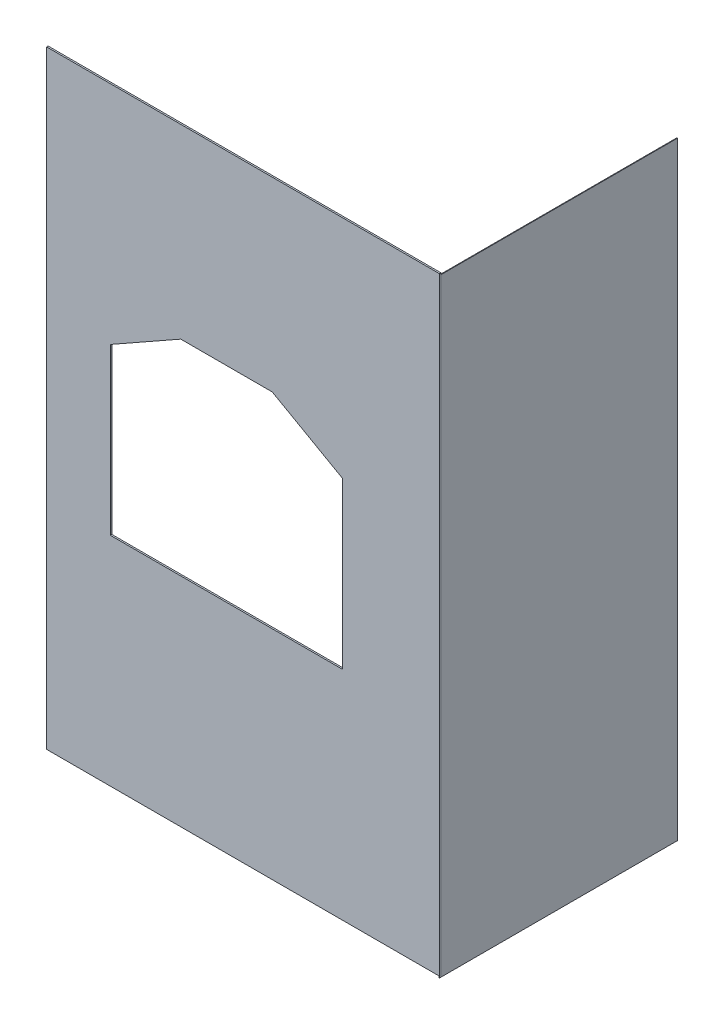
ISO-10303-21;
HEADER;
FILE_DESCRIPTION(('STEP AP214'),'2;1');
FILE_NAME('part.step','',(''),(''),'','','');
FILE_SCHEMA(('AUTOMOTIVE_DESIGN { 1 0 10303 214 1 1 1 1 }'));
ENDSEC;
DATA;
#1=APPLICATION_CONTEXT('core data for automotive mechanical design processes');
#2=APPLICATION_PROTOCOL_DEFINITION('international standard','automotive_design',2000,#1);
#3=PRODUCT_CONTEXT('',#1,'mechanical');
#4=PRODUCT('Part','Part','',(#3));
#5=PRODUCT_RELATED_PRODUCT_CATEGORY('part','',(#4));
#6=PRODUCT_DEFINITION_FORMATION('','',#4);
#7=PRODUCT_DEFINITION_CONTEXT('part definition',#1,'design');
#8=PRODUCT_DEFINITION('design','',#6,#7);
#9=PRODUCT_DEFINITION_SHAPE('','',#8);
#10=(LENGTH_UNIT() NAMED_UNIT(*) SI_UNIT(.MILLI.,.METRE.));
#11=(NAMED_UNIT(*) PLANE_ANGLE_UNIT() SI_UNIT($,.RADIAN.));
#12=(NAMED_UNIT(*) SI_UNIT($,.STERADIAN.) SOLID_ANGLE_UNIT());
#13=UNCERTAINTY_MEASURE_WITH_UNIT(LENGTH_MEASURE(1.E-05),#10,'distance_accuracy_value','');
#14=(GEOMETRIC_REPRESENTATION_CONTEXT(3) GLOBAL_UNCERTAINTY_ASSIGNED_CONTEXT((#13)) GLOBAL_UNIT_ASSIGNED_CONTEXT((#10,
#11,#12)) REPRESENTATION_CONTEXT('',''));
#15=CARTESIAN_POINT('',(0.,0.,0.));
#16=DIRECTION('',(0.,0.,1.));
#17=DIRECTION('',(1.,0.,0.));
#18=AXIS2_PLACEMENT_3D('',#15,#16,#17);
#19=CARTESIAN_POINT('',(-590.,2000.,-695.));
#20=DIRECTION('',(0.,0.,-1.));
#21=DIRECTION('',(0.,1.,0.));
#22=AXIS2_PLACEMENT_3D('',#19,#20,#21);
#23=PLANE('',#22);
#24=DIRECTION('',(1.,0.,0.));
#25=VECTOR('',#24,1.);
#26=CARTESIAN_POINT('',(-590.,1995.,-695.));
#27=LINE('',#26,#25);
#28=CARTESIAN_POINT('',(696.552073935795,1995.,-695.));
#29=VERTEX_POINT('',#28);
#30=CARTESIAN_POINT('',(698.552073935795,1995.,-695.));
#31=VERTEX_POINT('',#30);
#32=EDGE_CURVE('E196',#29,#31,#27,.T.);
#33=ORIENTED_EDGE('',*,*,#32,.F.);
#34=DIRECTION('',(0.,-1.,0.));
#35=VECTOR('',#34,1.);
#36=CARTESIAN_POINT('',(696.552073935795,2000.,-695.));
#37=LINE('',#36,#35);
#38=CARTESIAN_POINT('',(696.552073935795,4.99999999999989,-695.));
#39=VERTEX_POINT('',#38);
#40=EDGE_CURVE('E204',#29,#39,#37,.T.);
#41=ORIENTED_EDGE('',*,*,#40,.T.);
#42=DIRECTION('',(-1.,0.,0.));
#43=VECTOR('',#42,1.);
#44=CARTESIAN_POINT('',(698.752,4.99999999999989,-695.));
#45=LINE('',#44,#43);
#46=CARTESIAN_POINT('',(-590.,4.99999999999989,-695.));
#47=VERTEX_POINT('',#46);
#48=EDGE_CURVE('E224',#39,#47,#45,.T.);
#49=ORIENTED_EDGE('',*,*,#48,.T.);
#50=DIRECTION('',(0.,1.,0.));
#51=VECTOR('',#50,1.);
#52=CARTESIAN_POINT('',(-590.,5.00000000000012,-695.));
#53=LINE('',#52,#51);
#54=CARTESIAN_POINT('',(-590.,2000.,-695.));
#55=VERTEX_POINT('',#54);
#56=EDGE_CURVE('E217',#47,#55,#53,.T.);
#57=ORIENTED_EDGE('',*,*,#56,.T.);
#58=DIRECTION('',(1.,0.,0.));
#59=VECTOR('',#58,1.);
#60=CARTESIAN_POINT('',(-590.,2000.,-695.));
#61=LINE('',#60,#59);
#62=CARTESIAN_POINT('',(698.752,2000.,-695.));
#63=VERTEX_POINT('',#62);
#64=EDGE_CURVE('E220',#55,#63,#61,.T.);
#65=ORIENTED_EDGE('',*,*,#64,.T.);
#66=DIRECTION('',(0.,-1.,0.));
#67=VECTOR('',#66,1.);
#68=CARTESIAN_POINT('',(698.752,2000.,-695.));
#69=LINE('',#68,#67);
#70=CARTESIAN_POINT('',(698.752,5.00000000000012,-695.));
#71=VERTEX_POINT('',#70);
#72=EDGE_CURVE('E222',#63,#71,#69,.T.);
#73=ORIENTED_EDGE('',*,*,#72,.T.);
#74=CARTESIAN_POINT('',(698.552073935795,4.99999999999989,-695.));
#75=VERTEX_POINT('',#74);
#76=EDGE_CURVE('E225',#71,#75,#45,.T.);
#77=ORIENTED_EDGE('',*,*,#76,.T.);
#78=DIRECTION('',(0.,1.,0.));
#79=VECTOR('',#78,1.);
#80=CARTESIAN_POINT('',(698.552073935795,2000.,-695.));
#81=LINE('',#80,#79);
#82=EDGE_CURVE('E199',#75,#31,#81,.T.);
#83=ORIENTED_EDGE('',*,*,#82,.T.);
#84=EDGE_LOOP('',(#33,#41,#49,#57,#65,#73,#77,#83));
#85=FACE_BOUND('',#84,.T.);
#86=DIRECTION('',(-0.870562838720134,0.492057256667902,0.));
#87=VECTOR('',#86,1.);
#88=CARTESIAN_POINT('',(-672.134670487105,1854.68481375358,-695.));
#89=LINE('',#88,#87);
#90=CARTESIAN_POINT('',(380.,1260.,-695.));
#91=VERTEX_POINT('',#90);
#92=CARTESIAN_POINT('',(150.,1390.,-695.));
#93=VERTEX_POINT('',#92);
#94=EDGE_CURVE('E161',#91,#93,#89,.T.);
#95=ORIENTED_EDGE('',*,*,#94,.T.);
#96=DIRECTION('',(-1.,0.,0.));
#97=VECTOR('',#96,1.);
#98=CARTESIAN_POINT('',(-590.,1390.,-695.));
#99=LINE('',#98,#97);
#100=CARTESIAN_POINT('',(-150.000000000004,1390.,-695.));
#101=VERTEX_POINT('',#100);
#102=EDGE_CURVE('E164',#93,#101,#99,.T.);
#103=ORIENTED_EDGE('',*,*,#102,.T.);
#104=DIRECTION('',(-0.870562838720134,-0.492057256667902,0.));
#105=VECTOR('',#104,1.);
#106=CARTESIAN_POINT('',(-222.163323782236,1349.21203438396,-695.));
#107=LINE('',#106,#105);
#108=CARTESIAN_POINT('',(-379.929150836841,1260.04004517918,-695.));
#109=VERTEX_POINT('',#108);
#110=EDGE_CURVE('E146',#101,#109,#107,.T.);
#111=ORIENTED_EDGE('',*,*,#110,.T.);
#112=DIRECTION('',(-0.00235848400653943,-0.999997218772728,0.));
#113=VECTOR('',#112,1.);
#114=CARTESIAN_POINT('',(-378.185140479594,1999.50043665207,-695.));
#115=LINE('',#114,#113);
#116=CARTESIAN_POINT('',(-381.208726415094,717.5,-695.));
#117=VERTEX_POINT('',#116);
#118=EDGE_CURVE('E144',#109,#117,#115,.T.);
#119=ORIENTED_EDGE('',*,*,#118,.T.);
#120=DIRECTION('',(1.,0.,0.));
#121=VECTOR('',#120,1.);
#122=CARTESIAN_POINT('',(-590.,717.5,-695.));
#123=LINE('',#122,#121);
#124=CARTESIAN_POINT('',(380.,717.5,-695.));
#125=VERTEX_POINT('',#124);
#126=EDGE_CURVE('E155',#117,#125,#123,.T.);
#127=ORIENTED_EDGE('',*,*,#126,.T.);
#128=DIRECTION('',(0.,1.,0.));
#129=VECTOR('',#128,1.);
#130=CARTESIAN_POINT('',(380.,2000.,-695.));
#131=LINE('',#130,#129);
#132=EDGE_CURVE('E158',#125,#91,#131,.T.);
#133=ORIENTED_EDGE('',*,*,#132,.T.);
#134=EDGE_LOOP('',(#95,#103,#111,#119,#127,#133));
#135=FACE_BOUND('',#134,.T.);
#136=ADVANCED_FACE('F17',(#85,#135),#23,.T.);
#137=CARTESIAN_POINT('',(-590.,2000.,-690.));
#138=DIRECTION('',(0.,0.,-1.));
#139=DIRECTION('',(0.,1.,0.));
#140=AXIS2_PLACEMENT_3D('',#137,#138,#139);
#141=PLANE('',#140);
#142=DIRECTION('',(-1.,0.,0.));
#143=VECTOR('',#142,1.);
#144=CARTESIAN_POINT('',(698.752,4.99999999999989,-690.));
#145=LINE('',#144,#143);
#146=CARTESIAN_POINT('',(696.552073935795,4.99999999999989,-690.));
#147=VERTEX_POINT('',#146);
#148=CARTESIAN_POINT('',(-590.,4.99999999999989,-690.));
#149=VERTEX_POINT('',#148);
#150=EDGE_CURVE('E214',#147,#149,#145,.T.);
#151=ORIENTED_EDGE('',*,*,#150,.F.);
#152=DIRECTION('',(0.,-1.,0.));
#153=VECTOR('',#152,1.);
#154=CARTESIAN_POINT('',(696.552073935795,1995.,-690.));
#155=LINE('',#154,#153);
#156=CARTESIAN_POINT('',(696.552073935795,-1.26746757620616E-13,-690.));
#157=VERTEX_POINT('',#156);
#158=EDGE_CURVE('E191',#147,#157,#155,.T.);
#159=ORIENTED_EDGE('',*,*,#158,.T.);
#160=DIRECTION('',(1.,0.,0.));
#161=VECTOR('',#160,1.);
#162=CARTESIAN_POINT('',(696.552073935795,-1.26746757620616E-13,-690.));
#163=LINE('',#162,#161);
#164=CARTESIAN_POINT('',(698.552073935795,-1.26746757620616E-13,-690.));
#165=VERTEX_POINT('',#164);
#166=EDGE_CURVE('E171',#157,#165,#163,.T.);
#167=ORIENTED_EDGE('',*,*,#166,.T.);
#168=DIRECTION('',(0.,-1.,0.));
#169=VECTOR('',#168,1.);
#170=CARTESIAN_POINT('',(698.552073935795,1995.,-690.));
#171=LINE('',#170,#169);
#172=CARTESIAN_POINT('',(698.552073935795,4.99999999999989,-690.));
#173=VERTEX_POINT('',#172);
#174=EDGE_CURVE('E189',#173,#165,#171,.T.);
#175=ORIENTED_EDGE('',*,*,#174,.F.);
#176=CARTESIAN_POINT('',(698.752,5.00000000000012,-690.));
#177=VERTEX_POINT('',#176);
#178=EDGE_CURVE('E215',#177,#173,#145,.T.);
#179=ORIENTED_EDGE('',*,*,#178,.F.);
#180=DIRECTION('',(0.,-1.,0.));
#181=VECTOR('',#180,1.);
#182=CARTESIAN_POINT('',(698.752,2000.,-690.));
#183=LINE('',#182,#181);
#184=CARTESIAN_POINT('',(698.752,2000.,-690.));
#185=VERTEX_POINT('',#184);
#186=EDGE_CURVE('E212',#185,#177,#183,.T.);
#187=ORIENTED_EDGE('',*,*,#186,.F.);
#188=DIRECTION('',(1.,0.,0.));
#189=VECTOR('',#188,1.);
#190=CARTESIAN_POINT('',(-590.,2000.,-690.));
#191=LINE('',#190,#189);
#192=CARTESIAN_POINT('',(-590.,2000.,-690.));
#193=VERTEX_POINT('',#192);
#194=EDGE_CURVE('E210',#193,#185,#191,.T.);
#195=ORIENTED_EDGE('',*,*,#194,.F.);
#196=DIRECTION('',(0.,1.,0.));
#197=VECTOR('',#196,1.);
#198=CARTESIAN_POINT('',(-590.,5.00000000000012,-690.));
#199=LINE('',#198,#197);
#200=EDGE_CURVE('E209',#149,#193,#199,.T.);
#201=ORIENTED_EDGE('',*,*,#200,.F.);
#202=EDGE_LOOP('',(#151,#159,#167,#175,#179,#187,#195,#201));
#203=FACE_BOUND('',#202,.T.);
#204=DIRECTION('',(-1.,0.,0.));
#205=VECTOR('',#204,1.);
#206=CARTESIAN_POINT('',(-590.,1390.,-690.));
#207=LINE('',#206,#205);
#208=CARTESIAN_POINT('',(150.,1390.,-690.));
#209=VERTEX_POINT('',#208);
#210=CARTESIAN_POINT('',(-150.000000000004,1390.,-690.));
#211=VERTEX_POINT('',#210);
#212=EDGE_CURVE('E11',#209,#211,#207,.T.);
#213=ORIENTED_EDGE('',*,*,#212,.F.);
#214=DIRECTION('',(-0.870562838720134,0.492057256667902,0.));
#215=VECTOR('',#214,1.);
#216=CARTESIAN_POINT('',(-672.134670487105,1854.68481375358,-690.));
#217=LINE('',#216,#215);
#218=CARTESIAN_POINT('',(380.,1260.,-690.));
#219=VERTEX_POINT('',#218);
#220=EDGE_CURVE('E25',#219,#209,#217,.T.);
#221=ORIENTED_EDGE('',*,*,#220,.F.);
#222=DIRECTION('',(0.,1.,0.));
#223=VECTOR('',#222,1.);
#224=CARTESIAN_POINT('',(380.,2000.,-690.));
#225=LINE('',#224,#223);
#226=CARTESIAN_POINT('',(380.,717.5,-690.));
#227=VERTEX_POINT('',#226);
#228=EDGE_CURVE('E242',#227,#219,#225,.T.);
#229=ORIENTED_EDGE('',*,*,#228,.F.);
#230=DIRECTION('',(1.,0.,0.));
#231=VECTOR('',#230,1.);
#232=CARTESIAN_POINT('',(-590.,717.5,-690.));
#233=LINE('',#232,#231);
#234=CARTESIAN_POINT('',(-381.208726415094,717.5,-690.));
#235=VERTEX_POINT('',#234);
#236=EDGE_CURVE('E131',#235,#227,#233,.T.);
#237=ORIENTED_EDGE('',*,*,#236,.F.);
#238=DIRECTION('',(-0.00235848400653943,-0.999997218772728,0.));
#239=VECTOR('',#238,1.);
#240=CARTESIAN_POINT('',(-378.185140479594,1999.50043665207,-690.));
#241=LINE('',#240,#239);
#242=CARTESIAN_POINT('',(-379.929150836841,1260.04004517918,-690.));
#243=VERTEX_POINT('',#242);
#244=EDGE_CURVE('E127',#243,#235,#241,.T.);
#245=ORIENTED_EDGE('',*,*,#244,.F.);
#246=DIRECTION('',(-0.870562838720134,-0.492057256667902,0.));
#247=VECTOR('',#246,1.);
#248=CARTESIAN_POINT('',(-222.163323782236,1349.21203438396,-690.));
#249=LINE('',#248,#247);
#250=EDGE_CURVE('E129',#211,#243,#249,.T.);
#251=ORIENTED_EDGE('',*,*,#250,.F.);
#252=EDGE_LOOP('',(#213,#221,#229,#237,#245,#251));
#253=FACE_BOUND('',#252,.T.);
#254=ADVANCED_FACE('F128',(#203,#253),#141,.F.);
#255=CARTESIAN_POINT('',(698.752,4.99999999999989,-695.));
#256=DIRECTION('',(0.,1.,0.));
#257=DIRECTION('',(1.,0.,0.));
#258=AXIS2_PLACEMENT_3D('',#255,#256,#257);
#259=PLANE('',#258);
#260=DIRECTION('',(0.,0.,-1.));
#261=VECTOR('',#260,1.);
#262=CARTESIAN_POINT('',(696.552073935795,4.99999999999989,-695.));
#263=LINE('',#262,#261);
#264=EDGE_CURVE('E206',#147,#39,#263,.T.);
#265=ORIENTED_EDGE('',*,*,#264,.F.);
#266=ORIENTED_EDGE('',*,*,#150,.T.);
#267=DIRECTION('',(0.,0.,1.));
#268=VECTOR('',#267,1.);
#269=CARTESIAN_POINT('',(-590.,4.99999999999989,-695.));
#270=LINE('',#269,#268);
#271=EDGE_CURVE('E228',#47,#149,#270,.T.);
#272=ORIENTED_EDGE('',*,*,#271,.F.);
#273=ORIENTED_EDGE('',*,*,#48,.F.);
#274=EDGE_LOOP('',(#265,#266,#272,#273));
#275=FACE_BOUND('',#274,.T.);
#276=ADVANCED_FACE('F271',(#275),#259,.F.);
#277=DIRECTION('',(0.,0.,1.));
#278=VECTOR('',#277,1.);
#279=CARTESIAN_POINT('',(698.552073935795,4.99999999999989,-695.));
#280=LINE('',#279,#278);
#281=EDGE_CURVE('E201',#75,#173,#280,.T.);
#282=ORIENTED_EDGE('',*,*,#281,.F.);
#283=ORIENTED_EDGE('',*,*,#76,.F.);
#284=DIRECTION('',(0.,0.,1.));
#285=VECTOR('',#284,1.);
#286=CARTESIAN_POINT('',(698.752,5.00000000000012,-695.));
#287=LINE('',#286,#285);
#288=EDGE_CURVE('E233',#71,#177,#287,.T.);
#289=ORIENTED_EDGE('',*,*,#288,.T.);
#290=ORIENTED_EDGE('',*,*,#178,.T.);
#291=EDGE_LOOP('',(#282,#283,#289,#290));
#292=FACE_BOUND('',#291,.T.);
#293=ADVANCED_FACE('F278',(#292),#259,.F.);
#294=CARTESIAN_POINT('',(-590.,5.00000000000012,-695.));
#295=DIRECTION('',(1.,0.,0.));
#296=DIRECTION('',(0.,-1.,0.));
#297=AXIS2_PLACEMENT_3D('',#294,#295,#296);
#298=PLANE('',#297);
#299=ORIENTED_EDGE('',*,*,#200,.T.);
#300=DIRECTION('',(0.,0.,1.));
#301=VECTOR('',#300,1.);
#302=CARTESIAN_POINT('',(-590.,2000.,-695.));
#303=LINE('',#302,#301);
#304=EDGE_CURVE('E140',#55,#193,#303,.T.);
#305=ORIENTED_EDGE('',*,*,#304,.F.);
#306=ORIENTED_EDGE('',*,*,#56,.F.);
#307=ORIENTED_EDGE('',*,*,#271,.T.);
#308=EDGE_LOOP('',(#299,#305,#306,#307));
#309=FACE_BOUND('',#308,.T.);
#310=ADVANCED_FACE('F19',(#309),#298,.F.);
#311=CARTESIAN_POINT('',(-590.,2000.,-695.));
#312=DIRECTION('',(0.,-1.,0.));
#313=DIRECTION('',(-1.,0.,0.));
#314=AXIS2_PLACEMENT_3D('',#311,#312,#313);
#315=PLANE('',#314);
#316=ORIENTED_EDGE('',*,*,#194,.T.);
#317=DIRECTION('',(0.,0.,1.));
#318=VECTOR('',#317,1.);
#319=CARTESIAN_POINT('',(698.752,2000.,-695.));
#320=LINE('',#319,#318);
#321=EDGE_CURVE('E236',#63,#185,#320,.T.);
#322=ORIENTED_EDGE('',*,*,#321,.F.);
#323=ORIENTED_EDGE('',*,*,#64,.F.);
#324=ORIENTED_EDGE('',*,*,#304,.T.);
#325=EDGE_LOOP('',(#316,#322,#323,#324));
#326=FACE_BOUND('',#325,.T.);
#327=ADVANCED_FACE('F283',(#326),#315,.F.);
#328=CARTESIAN_POINT('',(698.752,2000.,-695.));
#329=DIRECTION('',(-1.,0.,0.));
#330=DIRECTION('',(0.,1.,0.));
#331=AXIS2_PLACEMENT_3D('',#328,#329,#330);
#332=PLANE('',#331);
#333=ORIENTED_EDGE('',*,*,#186,.T.);
#334=ORIENTED_EDGE('',*,*,#288,.F.);
#335=ORIENTED_EDGE('',*,*,#72,.F.);
#336=ORIENTED_EDGE('',*,*,#321,.T.);
#337=EDGE_LOOP('',(#333,#334,#335,#336));
#338=FACE_BOUND('',#337,.T.);
#339=ADVANCED_FACE('F280',(#338),#332,.F.);
#340=CARTESIAN_POINT('',(696.552073935795,1995.,-1470.));
#341=DIRECTION('',(1.,0.,0.));
#342=DIRECTION('',(0.,0.,-1.));
#343=AXIS2_PLACEMENT_3D('',#340,#341,#342);
#344=PLANE('',#343);
#345=ORIENTED_EDGE('',*,*,#158,.F.);
#346=ORIENTED_EDGE('',*,*,#264,.T.);
#347=ORIENTED_EDGE('',*,*,#40,.F.);
#348=DIRECTION('',(0.,0.,1.));
#349=VECTOR('',#348,1.);
#350=CARTESIAN_POINT('',(696.552073935795,1995.,-1470.));
#351=LINE('',#350,#349);
#352=CARTESIAN_POINT('',(696.552073935795,1995.,-1470.));
#353=VERTEX_POINT('',#352);
#354=EDGE_CURVE('E179',#353,#29,#351,.T.);
#355=ORIENTED_EDGE('',*,*,#354,.F.);
#356=DIRECTION('',(0.,-1.,0.));
#357=VECTOR('',#356,1.);
#358=CARTESIAN_POINT('',(696.552073935795,1995.,-1470.));
#359=LINE('',#358,#357);
#360=CARTESIAN_POINT('',(696.552073935795,-2.70025701017835E-13,-1470.));
#361=VERTEX_POINT('',#360);
#362=EDGE_CURVE('E193',#353,#361,#359,.T.);
#363=ORIENTED_EDGE('',*,*,#362,.T.);
#364=DIRECTION('',(0.,0.,1.));
#365=VECTOR('',#364,1.);
#366=CARTESIAN_POINT('',(696.552073935795,-2.70025701017835E-13,-1470.));
#367=LINE('',#366,#365);
#368=EDGE_CURVE('E168',#361,#157,#367,.T.);
#369=ORIENTED_EDGE('',*,*,#368,.T.);
#370=EDGE_LOOP('',(#345,#346,#347,#355,#363,#369));
#371=FACE_BOUND('',#370,.T.);
#372=ADVANCED_FACE('F282',(#371),#344,.F.);
#373=CARTESIAN_POINT('',(698.552073935795,1995.,-690.));
#374=DIRECTION('',(-1.,0.,0.));
#375=DIRECTION('',(0.,0.,1.));
#376=AXIS2_PLACEMENT_3D('',#373,#374,#375);
#377=PLANE('',#376);
#378=ORIENTED_EDGE('',*,*,#82,.F.);
#379=ORIENTED_EDGE('',*,*,#281,.T.);
#380=ORIENTED_EDGE('',*,*,#174,.T.);
#381=DIRECTION('',(0.,0.,-1.));
#382=VECTOR('',#381,1.);
#383=CARTESIAN_POINT('',(698.552073935795,-1.26746757620616E-13,-690.));
#384=LINE('',#383,#382);
#385=CARTESIAN_POINT('',(698.552073935795,-2.70025701017835E-13,-1470.));
#386=VERTEX_POINT('',#385);
#387=EDGE_CURVE('E174',#165,#386,#384,.T.);
#388=ORIENTED_EDGE('',*,*,#387,.T.);
#389=DIRECTION('',(0.,-1.,0.));
#390=VECTOR('',#389,1.);
#391=CARTESIAN_POINT('',(698.552073935795,1995.,-1470.));
#392=LINE('',#391,#390);
#393=CARTESIAN_POINT('',(698.552073935795,1995.,-1470.));
#394=VERTEX_POINT('',#393);
#395=EDGE_CURVE('E184',#394,#386,#392,.T.);
#396=ORIENTED_EDGE('',*,*,#395,.F.);
#397=DIRECTION('',(0.,0.,-1.));
#398=VECTOR('',#397,1.);
#399=CARTESIAN_POINT('',(698.552073935795,1995.,-690.));
#400=LINE('',#399,#398);
#401=EDGE_CURVE('E182',#31,#394,#400,.T.);
#402=ORIENTED_EDGE('',*,*,#401,.F.);
#403=EDGE_LOOP('',(#378,#379,#380,#388,#396,#402));
#404=FACE_BOUND('',#403,.T.);
#405=ADVANCED_FACE('F303',(#404),#377,.F.);
#406=CARTESIAN_POINT('',(698.552073935795,1995.,-1470.));
#407=DIRECTION('',(0.,0.,1.));
#408=DIRECTION('',(1.,0.,0.));
#409=AXIS2_PLACEMENT_3D('',#406,#407,#408);
#410=PLANE('',#409);
#411=DIRECTION('',(-1.,0.,0.));
#412=VECTOR('',#411,1.);
#413=CARTESIAN_POINT('',(698.552073935795,-2.70025701017835E-13,-1470.));
#414=LINE('',#413,#412);
#415=EDGE_CURVE('E167',#386,#361,#414,.T.);
#416=ORIENTED_EDGE('',*,*,#415,.T.);
#417=ORIENTED_EDGE('',*,*,#362,.F.);
#418=DIRECTION('',(-1.,0.,0.));
#419=VECTOR('',#418,1.);
#420=CARTESIAN_POINT('',(698.552073935795,1995.,-1470.));
#421=LINE('',#420,#419);
#422=EDGE_CURVE('E176',#394,#353,#421,.T.);
#423=ORIENTED_EDGE('',*,*,#422,.F.);
#424=ORIENTED_EDGE('',*,*,#395,.T.);
#425=EDGE_LOOP('',(#416,#417,#423,#424));
#426=FACE_BOUND('',#425,.T.);
#427=ADVANCED_FACE('F323',(#426),#410,.F.);
#428=CARTESIAN_POINT('',(696.552073935795,1995.,-1470.));
#429=DIRECTION('',(0.,1.,0.));
#430=DIRECTION('',(-1.,0.,0.));
#431=AXIS2_PLACEMENT_3D('',#428,#429,#430);
#432=PLANE('',#431);
#433=ORIENTED_EDGE('',*,*,#354,.T.);
#434=ORIENTED_EDGE('',*,*,#32,.T.);
#435=ORIENTED_EDGE('',*,*,#401,.T.);
#436=ORIENTED_EDGE('',*,*,#422,.T.);
#437=EDGE_LOOP('',(#433,#434,#435,#436));
#438=FACE_BOUND('',#437,.T.);
#439=ADVANCED_FACE('F308',(#438),#432,.T.);
#440=CARTESIAN_POINT('',(696.552073935795,-2.70025701017835E-13,-1470.));
#441=DIRECTION('',(0.,1.,0.));
#442=DIRECTION('',(-1.,0.,0.));
#443=AXIS2_PLACEMENT_3D('',#440,#441,#442);
#444=PLANE('',#443);
#445=ORIENTED_EDGE('',*,*,#415,.F.);
#446=ORIENTED_EDGE('',*,*,#387,.F.);
#447=ORIENTED_EDGE('',*,*,#166,.F.);
#448=ORIENTED_EDGE('',*,*,#368,.F.);
#449=EDGE_LOOP('',(#445,#446,#447,#448));
#450=FACE_BOUND('',#449,.T.);
#451=ADVANCED_FACE('F321',(#450),#444,.F.);
#452=CARTESIAN_POINT('',(-150.000000000004,1390.,-720.));
#453=DIRECTION('',(0.,-1.,0.));
#454=DIRECTION('',(-1.,0.,0.));
#455=AXIS2_PLACEMENT_3D('',#452,#453,#454);
#456=PLANE('',#455);
#457=ORIENTED_EDGE('',*,*,#102,.F.);
#458=DIRECTION('',(0.,0.,1.));
#459=VECTOR('',#458,1.);
#460=CARTESIAN_POINT('',(150.,1390.,-720.));
#461=LINE('',#460,#459);
#462=EDGE_CURVE('E249',#93,#209,#461,.T.);
#463=ORIENTED_EDGE('',*,*,#462,.T.);
#464=ORIENTED_EDGE('',*,*,#212,.T.);
#465=DIRECTION('',(0.,0.,1.));
#466=VECTOR('',#465,1.);
#467=CARTESIAN_POINT('',(-150.000000000004,1390.,-720.));
#468=LINE('',#467,#466);
#469=EDGE_CURVE('E139',#101,#211,#468,.T.);
#470=ORIENTED_EDGE('',*,*,#469,.F.);
#471=EDGE_LOOP('',(#457,#463,#464,#470));
#472=FACE_BOUND('',#471,.T.);
#473=ADVANCED_FACE('F253',(#472),#456,.T.);
#474=CARTESIAN_POINT('',(150.,1390.,-720.));
#475=DIRECTION('',(-0.492057256667902,-0.870562838720134,0.));
#476=DIRECTION('',(-0.870562838720134,0.492057256667902,0.));
#477=AXIS2_PLACEMENT_3D('',#474,#475,#476);
#478=PLANE('',#477);
#479=ORIENTED_EDGE('',*,*,#94,.F.);
#480=DIRECTION('',(0.,0.,1.));
#481=VECTOR('',#480,1.);
#482=CARTESIAN_POINT('',(380.,1260.,-720.));
#483=LINE('',#482,#481);
#484=EDGE_CURVE('E251',#91,#219,#483,.T.);
#485=ORIENTED_EDGE('',*,*,#484,.T.);
#486=ORIENTED_EDGE('',*,*,#220,.T.);
#487=ORIENTED_EDGE('',*,*,#462,.F.);
#488=EDGE_LOOP('',(#479,#485,#486,#487));
#489=FACE_BOUND('',#488,.T.);
#490=ADVANCED_FACE('F248',(#489),#478,.T.);
#491=CARTESIAN_POINT('',(380.,1260.,-720.));
#492=DIRECTION('',(-1.,0.,0.));
#493=DIRECTION('',(0.,1.,0.));
#494=AXIS2_PLACEMENT_3D('',#491,#492,#493);
#495=PLANE('',#494);
#496=ORIENTED_EDGE('',*,*,#132,.F.);
#497=DIRECTION('',(0.,0.,1.));
#498=VECTOR('',#497,1.);
#499=CARTESIAN_POINT('',(380.,717.5,-720.));
#500=LINE('',#499,#498);
#501=EDGE_CURVE('E150',#125,#227,#500,.T.);
#502=ORIENTED_EDGE('',*,*,#501,.T.);
#503=ORIENTED_EDGE('',*,*,#228,.T.);
#504=ORIENTED_EDGE('',*,*,#484,.F.);
#505=EDGE_LOOP('',(#496,#502,#503,#504));
#506=FACE_BOUND('',#505,.T.);
#507=ADVANCED_FACE('F260',(#506),#495,.T.);
#508=CARTESIAN_POINT('',(380.,717.5,-720.));
#509=DIRECTION('',(0.,1.,0.));
#510=DIRECTION('',(1.,0.,0.));
#511=AXIS2_PLACEMENT_3D('',#508,#509,#510);
#512=PLANE('',#511);
#513=ORIENTED_EDGE('',*,*,#126,.F.);
#514=DIRECTION('',(0.,0.,1.));
#515=VECTOR('',#514,1.);
#516=CARTESIAN_POINT('',(-381.208726415094,717.5,-720.));
#517=LINE('',#516,#515);
#518=EDGE_CURVE('E147',#117,#235,#517,.T.);
#519=ORIENTED_EDGE('',*,*,#518,.T.);
#520=ORIENTED_EDGE('',*,*,#236,.T.);
#521=ORIENTED_EDGE('',*,*,#501,.F.);
#522=EDGE_LOOP('',(#513,#519,#520,#521));
#523=FACE_BOUND('',#522,.T.);
#524=ADVANCED_FACE('F262',(#523),#512,.T.);
#525=CARTESIAN_POINT('',(-381.208726415094,717.5,-720.));
#526=DIRECTION('',(0.999997218772728,-0.00235848400653943,0.));
#527=DIRECTION('',(-0.00235848400653926,-0.999997218772728,0.));
#528=AXIS2_PLACEMENT_3D('',#525,#526,#527);
#529=PLANE('',#528);
#530=ORIENTED_EDGE('',*,*,#118,.F.);
#531=DIRECTION('',(0.,0.,1.));
#532=VECTOR('',#531,1.);
#533=CARTESIAN_POINT('',(-379.929150836841,1260.04004517918,-720.));
#534=LINE('',#533,#532);
#535=EDGE_CURVE('E32',#109,#243,#534,.T.);
#536=ORIENTED_EDGE('',*,*,#535,.T.);
#537=ORIENTED_EDGE('',*,*,#244,.T.);
#538=ORIENTED_EDGE('',*,*,#518,.F.);
#539=EDGE_LOOP('',(#530,#536,#537,#538));
#540=FACE_BOUND('',#539,.T.);
#541=ADVANCED_FACE('F142',(#540),#529,.T.);
#542=CARTESIAN_POINT('',(-379.929150836841,1260.04004517918,-720.));
#543=DIRECTION('',(0.492057256667902,-0.870562838720134,0.));
#544=DIRECTION('',(-0.870562838720135,-0.492057256667902,0.));
#545=AXIS2_PLACEMENT_3D('',#542,#543,#544);
#546=PLANE('',#545);
#547=ORIENTED_EDGE('',*,*,#110,.F.);
#548=ORIENTED_EDGE('',*,*,#469,.T.);
#549=ORIENTED_EDGE('',*,*,#250,.T.);
#550=ORIENTED_EDGE('',*,*,#535,.F.);
#551=EDGE_LOOP('',(#547,#548,#549,#550));
#552=FACE_BOUND('',#551,.T.);
#553=ADVANCED_FACE('F137',(#552),#546,.T.);
#554=CLOSED_SHELL('',(#136,#254,#276,#293,#310,#327,#339,#372,#405,#427,#439,#451,#473,#490,
#507,#524,#541,#553));
#555=MANIFOLD_SOLID_BREP('B1',#554);
#556=ADVANCED_BREP_SHAPE_REPRESENTATION('',(#18,#555),#14);
#557=SHAPE_DEFINITION_REPRESENTATION(#9,#556);
ENDSEC;
END-ISO-10303-21;
